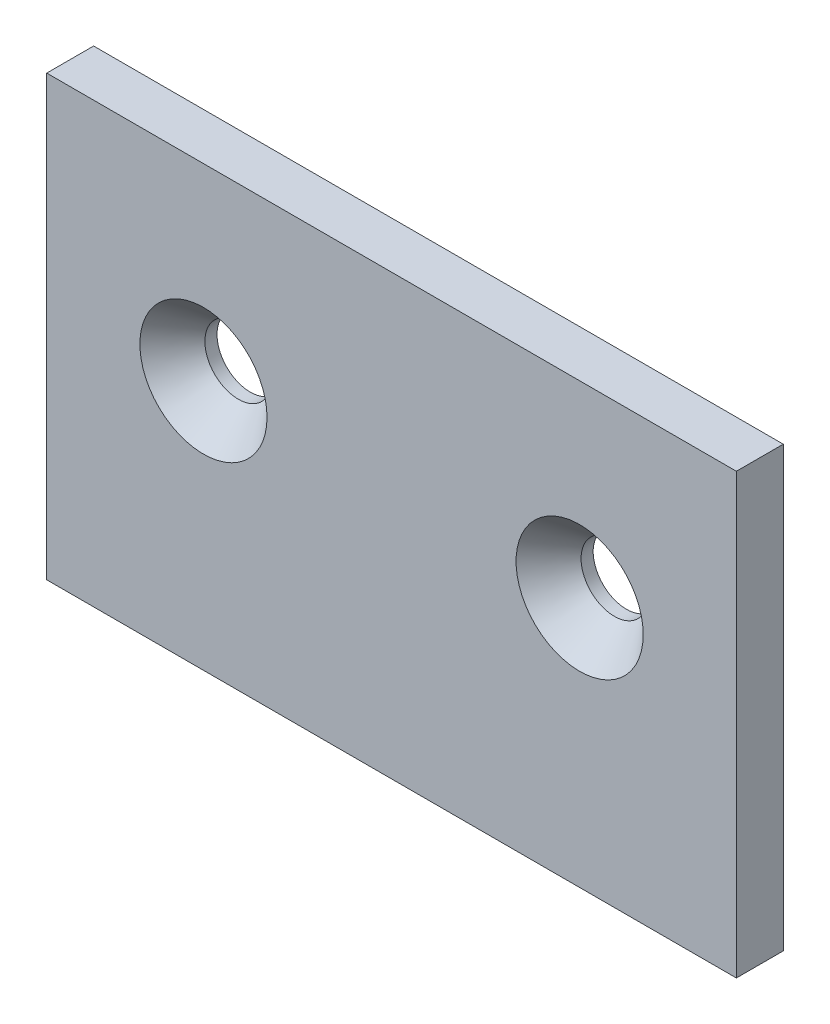
ISO-10303-21;
HEADER;
FILE_DESCRIPTION(('STEP AP214'),'2;1');
FILE_NAME('part.step','',(''),(''),'','','');
FILE_SCHEMA(('AUTOMOTIVE_DESIGN { 1 0 10303 214 1 1 1 1 }'));
ENDSEC;
DATA;
#1=APPLICATION_CONTEXT('core data for automotive mechanical design processes');
#2=APPLICATION_PROTOCOL_DEFINITION('international standard','automotive_design',2000,#1);
#3=PRODUCT_CONTEXT('',#1,'mechanical');
#4=PRODUCT('Part','Part','',(#3));
#5=PRODUCT_RELATED_PRODUCT_CATEGORY('part','',(#4));
#6=PRODUCT_DEFINITION_FORMATION('','',#4);
#7=PRODUCT_DEFINITION_CONTEXT('part definition',#1,'design');
#8=PRODUCT_DEFINITION('design','',#6,#7);
#9=PRODUCT_DEFINITION_SHAPE('','',#8);
#10=(LENGTH_UNIT() NAMED_UNIT(*) SI_UNIT(.MILLI.,.METRE.));
#11=(NAMED_UNIT(*) PLANE_ANGLE_UNIT() SI_UNIT($,.RADIAN.));
#12=(NAMED_UNIT(*) SI_UNIT($,.STERADIAN.) SOLID_ANGLE_UNIT());
#13=UNCERTAINTY_MEASURE_WITH_UNIT(LENGTH_MEASURE(1.E-05),#10,'distance_accuracy_value','');
#14=(GEOMETRIC_REPRESENTATION_CONTEXT(3) GLOBAL_UNCERTAINTY_ASSIGNED_CONTEXT((#13)) GLOBAL_UNIT_ASSIGNED_CONTEXT((#10,
#11,#12)) REPRESENTATION_CONTEXT('',''));
#15=CARTESIAN_POINT('',(0.,0.,0.));
#16=DIRECTION('',(0.,0.,1.));
#17=DIRECTION('',(1.,0.,0.));
#18=AXIS2_PLACEMENT_3D('',#15,#16,#17);
#19=CARTESIAN_POINT('',(34.925,-22.225,2.375));
#20=DIRECTION('',(-1.,0.,0.));
#21=DIRECTION('',(0.,0.,1.));
#22=AXIS2_PLACEMENT_3D('',#19,#20,#21);
#23=PLANE('',#22);
#24=DIRECTION('',(0.,1.,0.));
#25=VECTOR('',#24,1.);
#26=CARTESIAN_POINT('',(34.925,-22.225,-2.375));
#27=LINE('',#26,#25);
#28=CARTESIAN_POINT('',(34.925,-22.225,-2.375));
#29=VERTEX_POINT('',#28);
#30=CARTESIAN_POINT('',(34.925,22.225,-2.375));
#31=VERTEX_POINT('',#30);
#32=EDGE_CURVE('E96',#29,#31,#27,.T.);
#33=ORIENTED_EDGE('',*,*,#32,.T.);
#34=DIRECTION('',(0.,0.,-1.));
#35=VECTOR('',#34,1.);
#36=CARTESIAN_POINT('',(34.925,22.225,2.375));
#37=LINE('',#36,#35);
#38=CARTESIAN_POINT('',(34.925,22.225,2.375));
#39=VERTEX_POINT('',#38);
#40=EDGE_CURVE('E11',#39,#31,#37,.T.);
#41=ORIENTED_EDGE('',*,*,#40,.F.);
#42=DIRECTION('',(0.,1.,0.));
#43=VECTOR('',#42,1.);
#44=CARTESIAN_POINT('',(34.925,-22.225,2.375));
#45=LINE('',#44,#43);
#46=CARTESIAN_POINT('',(34.925,-22.225,2.375));
#47=VERTEX_POINT('',#46);
#48=EDGE_CURVE('E84',#47,#39,#45,.T.);
#49=ORIENTED_EDGE('',*,*,#48,.F.);
#50=DIRECTION('',(0.,0.,-1.));
#51=VECTOR('',#50,1.);
#52=CARTESIAN_POINT('',(34.925,-22.225,2.375));
#53=LINE('',#52,#51);
#54=EDGE_CURVE('E92',#47,#29,#53,.T.);
#55=ORIENTED_EDGE('',*,*,#54,.T.);
#56=EDGE_LOOP('',(#33,#41,#49,#55));
#57=FACE_BOUND('',#56,.T.);
#58=ADVANCED_FACE('F33',(#57),#23,.F.);
#59=CARTESIAN_POINT('',(-34.925,22.225,2.375));
#60=DIRECTION('',(0.,-1.,0.));
#61=DIRECTION('',(0.,0.,-1.));
#62=AXIS2_PLACEMENT_3D('',#59,#60,#61);
#63=PLANE('',#62);
#64=DIRECTION('',(-1.,0.,0.));
#65=VECTOR('',#64,1.);
#66=CARTESIAN_POINT('',(-34.925,22.225,-2.375));
#67=LINE('',#66,#65);
#68=CARTESIAN_POINT('',(-34.925,22.225,-2.375));
#69=VERTEX_POINT('',#68);
#70=EDGE_CURVE('E88',#31,#69,#67,.T.);
#71=ORIENTED_EDGE('',*,*,#70,.T.);
#72=DIRECTION('',(0.,0.,-1.));
#73=VECTOR('',#72,1.);
#74=CARTESIAN_POINT('',(-34.925,22.225,2.375));
#75=LINE('',#74,#73);
#76=CARTESIAN_POINT('',(-34.925,22.225,2.375));
#77=VERTEX_POINT('',#76);
#78=EDGE_CURVE('E41',#77,#69,#75,.T.);
#79=ORIENTED_EDGE('',*,*,#78,.F.);
#80=DIRECTION('',(-1.,0.,0.));
#81=VECTOR('',#80,1.);
#82=CARTESIAN_POINT('',(-34.925,22.225,2.375));
#83=LINE('',#82,#81);
#84=EDGE_CURVE('E79',#39,#77,#83,.T.);
#85=ORIENTED_EDGE('',*,*,#84,.F.);
#86=ORIENTED_EDGE('',*,*,#40,.T.);
#87=EDGE_LOOP('',(#71,#79,#85,#86));
#88=FACE_BOUND('',#87,.T.);
#89=ADVANCED_FACE('F87',(#88),#63,.F.);
#90=CARTESIAN_POINT('',(-34.925,-22.225,2.375));
#91=DIRECTION('',(1.,0.,0.));
#92=DIRECTION('',(0.,0.,-1.));
#93=AXIS2_PLACEMENT_3D('',#90,#91,#92);
#94=PLANE('',#93);
#95=DIRECTION('',(0.,-1.,0.));
#96=VECTOR('',#95,1.);
#97=CARTESIAN_POINT('',(-34.925,-22.225,-2.375));
#98=LINE('',#97,#96);
#99=CARTESIAN_POINT('',(-34.925,-22.225,-2.375));
#100=VERTEX_POINT('',#99);
#101=EDGE_CURVE('E66',#69,#100,#98,.T.);
#102=ORIENTED_EDGE('',*,*,#101,.T.);
#103=DIRECTION('',(0.,0.,-1.));
#104=VECTOR('',#103,1.);
#105=CARTESIAN_POINT('',(-34.925,-22.225,2.375));
#106=LINE('',#105,#104);
#107=CARTESIAN_POINT('',(-34.925,-22.225,2.375));
#108=VERTEX_POINT('',#107);
#109=EDGE_CURVE('E89',#108,#100,#106,.T.);
#110=ORIENTED_EDGE('',*,*,#109,.F.);
#111=DIRECTION('',(0.,-1.,0.));
#112=VECTOR('',#111,1.);
#113=CARTESIAN_POINT('',(-34.925,-22.225,2.375));
#114=LINE('',#113,#112);
#115=EDGE_CURVE('E82',#77,#108,#114,.T.);
#116=ORIENTED_EDGE('',*,*,#115,.F.);
#117=ORIENTED_EDGE('',*,*,#78,.T.);
#118=EDGE_LOOP('',(#102,#110,#116,#117));
#119=FACE_BOUND('',#118,.T.);
#120=ADVANCED_FACE('F90',(#119),#94,.F.);
#121=CARTESIAN_POINT('',(-34.925,-22.225,2.375));
#122=DIRECTION('',(0.,1.,0.));
#123=DIRECTION('',(0.,0.,1.));
#124=AXIS2_PLACEMENT_3D('',#121,#122,#123);
#125=PLANE('',#124);
#126=DIRECTION('',(1.,0.,0.));
#127=VECTOR('',#126,1.);
#128=CARTESIAN_POINT('',(-34.925,-22.225,-2.375));
#129=LINE('',#128,#127);
#130=EDGE_CURVE('E72',#100,#29,#129,.T.);
#131=ORIENTED_EDGE('',*,*,#130,.T.);
#132=ORIENTED_EDGE('',*,*,#54,.F.);
#133=DIRECTION('',(1.,0.,0.));
#134=VECTOR('',#133,1.);
#135=CARTESIAN_POINT('',(-34.925,-22.225,2.375));
#136=LINE('',#135,#134);
#137=EDGE_CURVE('E49',#108,#47,#136,.T.);
#138=ORIENTED_EDGE('',*,*,#137,.F.);
#139=ORIENTED_EDGE('',*,*,#109,.T.);
#140=EDGE_LOOP('',(#131,#132,#138,#139));
#141=FACE_BOUND('',#140,.T.);
#142=ADVANCED_FACE('F104',(#141),#125,.F.);
#143=CARTESIAN_POINT('',(0.,0.,2.375));
#144=DIRECTION('',(0.,0.,-1.));
#145=DIRECTION('',(-1.,0.,0.));
#146=AXIS2_PLACEMENT_3D('',#143,#144,#145);
#147=PLANE('',#146);
#148=CARTESIAN_POINT('',(19.05,3.175,2.375));
#149=DIRECTION('',(0.,0.,1.));
#150=DIRECTION('',(1.,0.,0.));
#151=AXIS2_PLACEMENT_3D('',#148,#149,#150);
#152=CIRCLE('',#151,6.4389);
#153=CARTESIAN_POINT('',(25.4889,3.175,2.375));
#154=VERTEX_POINT('',#153);
#155=EDGE_CURVE('E124',#154,#154,#152,.T.);
#156=ORIENTED_EDGE('',*,*,#155,.F.);
#157=EDGE_LOOP('',(#156));
#158=FACE_BOUND('',#157,.T.);
#159=CARTESIAN_POINT('',(-19.05,3.175,2.375));
#160=DIRECTION('',(0.,0.,1.));
#161=DIRECTION('',(1.,0.,0.));
#162=AXIS2_PLACEMENT_3D('',#159,#160,#161);
#163=CIRCLE('',#162,6.4389);
#164=CARTESIAN_POINT('',(-12.6111,3.175,2.375));
#165=VERTEX_POINT('',#164);
#166=EDGE_CURVE('E115',#165,#165,#163,.T.);
#167=ORIENTED_EDGE('',*,*,#166,.F.);
#168=EDGE_LOOP('',(#167));
#169=FACE_BOUND('',#168,.T.);
#170=ORIENTED_EDGE('',*,*,#48,.T.);
#171=ORIENTED_EDGE('',*,*,#84,.T.);
#172=ORIENTED_EDGE('',*,*,#115,.T.);
#173=ORIENTED_EDGE('',*,*,#137,.T.);
#174=EDGE_LOOP('',(#170,#171,#172,#173));
#175=FACE_BOUND('',#174,.T.);
#176=ADVANCED_FACE('F80',(#158,#169,#175),#147,.F.);
#177=CARTESIAN_POINT('',(0.,0.,-2.375));
#178=DIRECTION('',(0.,0.,-1.));
#179=DIRECTION('',(-1.,0.,0.));
#180=AXIS2_PLACEMENT_3D('',#177,#178,#179);
#181=PLANE('',#180);
#182=CARTESIAN_POINT('',(19.05,3.175,-2.375));
#183=DIRECTION('',(0.,0.,1.));
#184=DIRECTION('',(1.,0.,0.));
#185=AXIS2_PLACEMENT_3D('',#182,#183,#184);
#186=CIRCLE('',#185,3.3782);
#187=CARTESIAN_POINT('',(22.4282,3.175,-2.375));
#188=VERTEX_POINT('',#187);
#189=EDGE_CURVE('E118',#188,#188,#186,.T.);
#190=ORIENTED_EDGE('',*,*,#189,.T.);
#191=EDGE_LOOP('',(#190));
#192=FACE_BOUND('',#191,.T.);
#193=CARTESIAN_POINT('',(-19.05,3.175,-2.375));
#194=DIRECTION('',(0.,0.,1.));
#195=DIRECTION('',(1.,0.,0.));
#196=AXIS2_PLACEMENT_3D('',#193,#194,#195);
#197=CIRCLE('',#196,3.3782);
#198=CARTESIAN_POINT('',(-15.6718,3.175,-2.375));
#199=VERTEX_POINT('',#198);
#200=EDGE_CURVE('E99',#199,#199,#197,.T.);
#201=ORIENTED_EDGE('',*,*,#200,.T.);
#202=EDGE_LOOP('',(#201));
#203=FACE_BOUND('',#202,.T.);
#204=ORIENTED_EDGE('',*,*,#32,.F.);
#205=ORIENTED_EDGE('',*,*,#130,.F.);
#206=ORIENTED_EDGE('',*,*,#101,.F.);
#207=ORIENTED_EDGE('',*,*,#70,.F.);
#208=EDGE_LOOP('',(#204,#205,#206,#207));
#209=FACE_BOUND('',#208,.T.);
#210=ADVANCED_FACE('F107',(#192,#203,#209),#181,.T.);
#211=CARTESIAN_POINT('',(-19.05,3.175,2.375));
#212=DIRECTION('',(0.,0.,1.));
#213=DIRECTION('',(1.,0.,0.));
#214=AXIS2_PLACEMENT_3D('',#211,#212,#213);
#215=CYLINDRICAL_SURFACE('',#214,3.3782);
#216=ORIENTED_EDGE('',*,*,#200,.F.);
#217=EDGE_LOOP('',(#216));
#218=FACE_BOUND('',#217,.T.);
#219=CARTESIAN_POINT('',(-19.05,3.175,-1.14593258398135));
#220=DIRECTION('',(0.,0.,1.));
#221=DIRECTION('',(1.,0.,0.));
#222=AXIS2_PLACEMENT_3D('',#219,#220,#221);
#223=CIRCLE('',#222,3.3782);
#224=CARTESIAN_POINT('',(-15.6718,3.175,-1.14593258398135));
#225=VERTEX_POINT('',#224);
#226=EDGE_CURVE('E112',#225,#225,#223,.T.);
#227=ORIENTED_EDGE('',*,*,#226,.T.);
#228=EDGE_LOOP('',(#227));
#229=FACE_BOUND('',#228,.T.);
#230=ADVANCED_FACE('F138',(#218,#229),#215,.F.);
#231=CARTESIAN_POINT('',(-19.05,3.175,2.375));
#232=DIRECTION('',(0.,0.,1.));
#233=DIRECTION('',(1.,0.,0.));
#234=AXIS2_PLACEMENT_3D('',#231,#232,#233);
#235=CONICAL_SURFACE('',#234,6.4389,0.715584993317675);
#236=ORIENTED_EDGE('',*,*,#226,.F.);
#237=EDGE_LOOP('',(#236));
#238=FACE_BOUND('',#237,.T.);
#239=ORIENTED_EDGE('',*,*,#166,.T.);
#240=EDGE_LOOP('',(#239));
#241=FACE_BOUND('',#240,.T.);
#242=ADVANCED_FACE('F135',(#238,#241),#235,.F.);
#243=CARTESIAN_POINT('',(19.05,3.175,2.375));
#244=DIRECTION('',(0.,0.,1.));
#245=DIRECTION('',(1.,0.,0.));
#246=AXIS2_PLACEMENT_3D('',#243,#244,#245);
#247=CYLINDRICAL_SURFACE('',#246,3.3782);
#248=ORIENTED_EDGE('',*,*,#189,.F.);
#249=EDGE_LOOP('',(#248));
#250=FACE_BOUND('',#249,.T.);
#251=CARTESIAN_POINT('',(19.05,3.175,-1.14593258398135));
#252=DIRECTION('',(0.,0.,1.));
#253=DIRECTION('',(1.,0.,0.));
#254=AXIS2_PLACEMENT_3D('',#251,#252,#253);
#255=CIRCLE('',#254,3.3782);
#256=CARTESIAN_POINT('',(22.4282,3.175,-1.14593258398135));
#257=VERTEX_POINT('',#256);
#258=EDGE_CURVE('E121',#257,#257,#255,.T.);
#259=ORIENTED_EDGE('',*,*,#258,.T.);
#260=EDGE_LOOP('',(#259));
#261=FACE_BOUND('',#260,.T.);
#262=ADVANCED_FACE('F137',(#250,#261),#247,.F.);
#263=CARTESIAN_POINT('',(19.05,3.175,2.375));
#264=DIRECTION('',(0.,0.,1.));
#265=DIRECTION('',(1.,0.,0.));
#266=AXIS2_PLACEMENT_3D('',#263,#264,#265);
#267=CONICAL_SURFACE('',#266,6.4389,0.715584993317675);
#268=ORIENTED_EDGE('',*,*,#258,.F.);
#269=EDGE_LOOP('',(#268));
#270=FACE_BOUND('',#269,.T.);
#271=ORIENTED_EDGE('',*,*,#155,.T.);
#272=EDGE_LOOP('',(#271));
#273=FACE_BOUND('',#272,.T.);
#274=ADVANCED_FACE('F128',(#270,#273),#267,.F.);
#275=CLOSED_SHELL('',(#58,#89,#120,#142,#176,#210,#230,#242,#262,#274));
#276=MANIFOLD_SOLID_BREP('B2',#275);
#277=ADVANCED_BREP_SHAPE_REPRESENTATION('',(#18,#276),#14);
#278=SHAPE_DEFINITION_REPRESENTATION(#9,#277);
ENDSEC;
END-ISO-10303-21;
